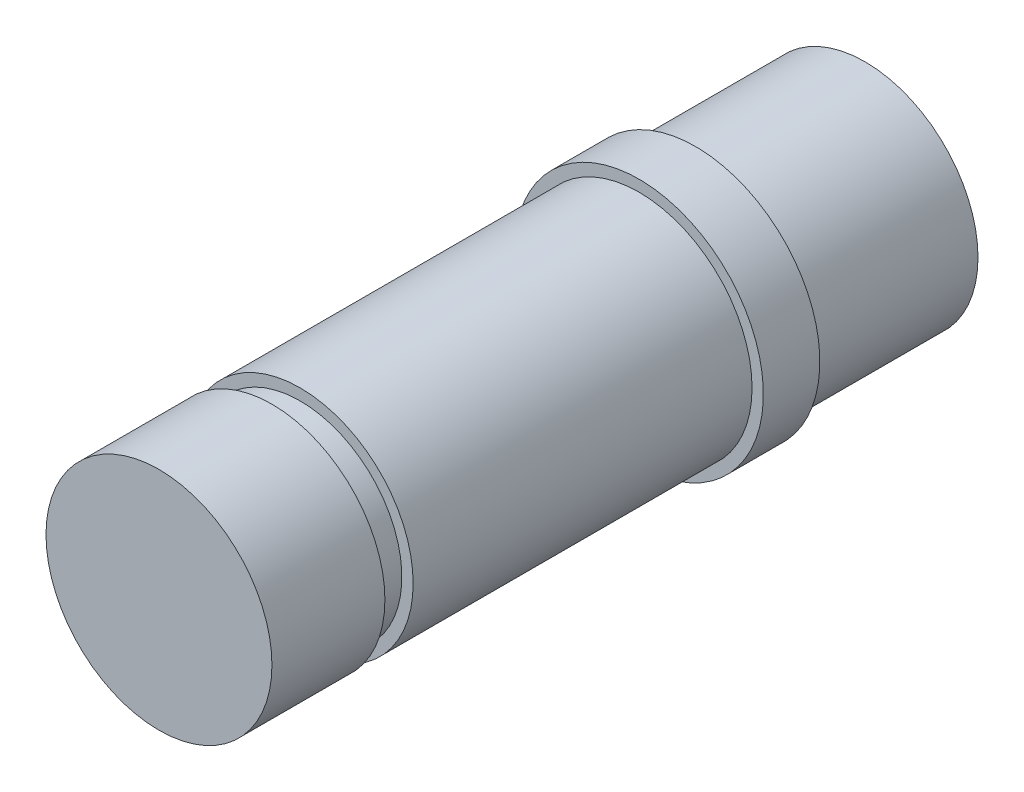
ISO-10303-21;
HEADER;
FILE_DESCRIPTION(('STEP AP214'),'2;1');
FILE_NAME('part.step','',(''),(''),'','','');
FILE_SCHEMA(('AUTOMOTIVE_DESIGN { 1 0 10303 214 1 1 1 1 }'));
ENDSEC;
DATA;
#1=APPLICATION_CONTEXT('core data for automotive mechanical design processes');
#2=APPLICATION_PROTOCOL_DEFINITION('international standard','automotive_design',2000,#1);
#3=PRODUCT_CONTEXT('',#1,'mechanical');
#4=PRODUCT('Part','Part','',(#3));
#5=PRODUCT_RELATED_PRODUCT_CATEGORY('part','',(#4));
#6=PRODUCT_DEFINITION_FORMATION('','',#4);
#7=PRODUCT_DEFINITION_CONTEXT('part definition',#1,'design');
#8=PRODUCT_DEFINITION('design','',#6,#7);
#9=PRODUCT_DEFINITION_SHAPE('','',#8);
#10=(LENGTH_UNIT() NAMED_UNIT(*) SI_UNIT(.MILLI.,.METRE.));
#11=(NAMED_UNIT(*) PLANE_ANGLE_UNIT() SI_UNIT($,.RADIAN.));
#12=(NAMED_UNIT(*) SI_UNIT($,.STERADIAN.) SOLID_ANGLE_UNIT());
#13=UNCERTAINTY_MEASURE_WITH_UNIT(LENGTH_MEASURE(1.E-05),#10,'distance_accuracy_value','');
#14=(GEOMETRIC_REPRESENTATION_CONTEXT(3) GLOBAL_UNCERTAINTY_ASSIGNED_CONTEXT((#13)) GLOBAL_UNIT_ASSIGNED_CONTEXT((#10,
#11,#12)) REPRESENTATION_CONTEXT('',''));
#15=CARTESIAN_POINT('',(0.,0.,0.));
#16=DIRECTION('',(0.,0.,1.));
#17=DIRECTION('',(1.,0.,0.));
#18=AXIS2_PLACEMENT_3D('',#15,#16,#17);
#19=CARTESIAN_POINT('',(0.,0.,20.));
#20=DIRECTION('',(0.,0.,-1.));
#21=DIRECTION('',(-1.,0.,0.));
#22=AXIS2_PLACEMENT_3D('',#19,#20,#21);
#23=CYLINDRICAL_SURFACE('',#22,20.);
#24=CARTESIAN_POINT('',(0.,0.,20.));
#25=DIRECTION('',(0.,0.,1.));
#26=DIRECTION('',(1.,0.,0.));
#27=AXIS2_PLACEMENT_3D('',#24,#25,#26);
#28=CIRCLE('',#27,20.);
#29=CARTESIAN_POINT('',(20.,0.,20.));
#30=VERTEX_POINT('',#29);
#31=EDGE_CURVE('E47',#30,#30,#28,.T.);
#32=ORIENTED_EDGE('',*,*,#31,.F.);
#33=EDGE_LOOP('',(#32));
#34=FACE_BOUND('',#33,.T.);
#35=CARTESIAN_POINT('',(0.,0.,0.));
#36=DIRECTION('',(0.,0.,1.));
#37=DIRECTION('',(1.,0.,0.));
#38=AXIS2_PLACEMENT_3D('',#35,#36,#37);
#39=CIRCLE('',#38,20.);
#40=CARTESIAN_POINT('',(20.,0.,0.));
#41=VERTEX_POINT('',#40);
#42=EDGE_CURVE('E38',#41,#41,#39,.T.);
#43=ORIENTED_EDGE('',*,*,#42,.T.);
#44=EDGE_LOOP('',(#43));
#45=FACE_BOUND('',#44,.T.);
#46=ADVANCED_FACE('F35',(#34,#45),#23,.T.);
#47=CARTESIAN_POINT('',(0.,0.,20.));
#48=DIRECTION('',(0.,0.,1.));
#49=DIRECTION('',(1.,0.,0.));
#50=AXIS2_PLACEMENT_3D('',#47,#48,#49);
#51=PLANE('',#50);
#52=ORIENTED_EDGE('',*,*,#31,.T.);
#53=EDGE_LOOP('',(#52));
#54=FACE_BOUND('',#53,.T.);
#55=ADVANCED_FACE('F76',(#54),#51,.T.);
#56=CARTESIAN_POINT('',(0.,0.,0.));
#57=DIRECTION('',(0.,0.,1.));
#58=DIRECTION('',(1.,0.,0.));
#59=AXIS2_PLACEMENT_3D('',#56,#57,#58);
#60=PLANE('',#59);
#61=CARTESIAN_POINT('',(0.,0.,0.));
#62=DIRECTION('',(0.,0.,-1.));
#63=DIRECTION('',(-1.,0.,0.));
#64=AXIS2_PLACEMENT_3D('',#61,#62,#63);
#65=CIRCLE('',#64,18.);
#66=CARTESIAN_POINT('',(-18.,0.,0.));
#67=VERTEX_POINT('',#66);
#68=EDGE_CURVE('E42',#67,#67,#65,.T.);
#69=ORIENTED_EDGE('',*,*,#68,.F.);
#70=EDGE_LOOP('',(#69));
#71=FACE_BOUND('',#70,.T.);
#72=ORIENTED_EDGE('',*,*,#42,.F.);
#73=EDGE_LOOP('',(#72));
#74=FACE_BOUND('',#73,.T.);
#75=ADVANCED_FACE('F73',(#71,#74),#60,.F.);
#76=CARTESIAN_POINT('',(0.,0.,-5.));
#77=DIRECTION('',(0.,0.,1.));
#78=DIRECTION('',(1.,0.,0.));
#79=AXIS2_PLACEMENT_3D('',#76,#77,#78);
#80=CYLINDRICAL_SURFACE('',#79,18.);
#81=CARTESIAN_POINT('',(0.,0.,-5.));
#82=DIRECTION('',(0.,0.,-1.));
#83=DIRECTION('',(-1.,0.,0.));
#84=AXIS2_PLACEMENT_3D('',#81,#82,#83);
#85=CIRCLE('',#84,18.);
#86=CARTESIAN_POINT('',(-18.,0.,-5.));
#87=VERTEX_POINT('',#86);
#88=EDGE_CURVE('E62',#87,#87,#85,.T.);
#89=ORIENTED_EDGE('',*,*,#88,.F.);
#90=EDGE_LOOP('',(#89));
#91=FACE_BOUND('',#90,.T.);
#92=ORIENTED_EDGE('',*,*,#68,.T.);
#93=EDGE_LOOP('',(#92));
#94=FACE_BOUND('',#93,.T.);
#95=ADVANCED_FACE('F75',(#91,#94),#80,.T.);
#96=CARTESIAN_POINT('',(0.,0.,-65.));
#97=DIRECTION('',(0.,0.,1.));
#98=DIRECTION('',(1.,0.,0.));
#99=AXIS2_PLACEMENT_3D('',#96,#97,#98);
#100=CYLINDRICAL_SURFACE('',#99,20.);
#101=CARTESIAN_POINT('',(0.,0.,-65.));
#102=DIRECTION('',(0.,0.,-1.));
#103=DIRECTION('',(-1.,0.,0.));
#104=AXIS2_PLACEMENT_3D('',#101,#102,#103);
#105=CIRCLE('',#104,20.);
#106=CARTESIAN_POINT('',(-20.,0.,-65.));
#107=VERTEX_POINT('',#106);
#108=EDGE_CURVE('E59',#107,#107,#105,.T.);
#109=ORIENTED_EDGE('',*,*,#108,.F.);
#110=EDGE_LOOP('',(#109));
#111=FACE_BOUND('',#110,.T.);
#112=CARTESIAN_POINT('',(0.,0.,-5.));
#113=DIRECTION('',(0.,0.,-1.));
#114=DIRECTION('',(-1.,0.,0.));
#115=AXIS2_PLACEMENT_3D('',#112,#113,#114);
#116=CIRCLE('',#115,20.);
#117=CARTESIAN_POINT('',(-20.,0.,-5.));
#118=VERTEX_POINT('',#117);
#119=EDGE_CURVE('E55',#118,#118,#116,.T.);
#120=ORIENTED_EDGE('',*,*,#119,.T.);
#121=EDGE_LOOP('',(#120));
#122=FACE_BOUND('',#121,.T.);
#123=ADVANCED_FACE('F82',(#111,#122),#100,.T.);
#124=CARTESIAN_POINT('',(0.,0.,-5.));
#125=DIRECTION('',(0.,0.,-1.));
#126=DIRECTION('',(-1.,0.,0.));
#127=AXIS2_PLACEMENT_3D('',#124,#125,#126);
#128=PLANE('',#127);
#129=ORIENTED_EDGE('',*,*,#88,.T.);
#130=EDGE_LOOP('',(#129));
#131=FACE_BOUND('',#130,.T.);
#132=ORIENTED_EDGE('',*,*,#119,.F.);
#133=EDGE_LOOP('',(#132));
#134=FACE_BOUND('',#133,.T.);
#135=ADVANCED_FACE('F117',(#131,#134),#128,.F.);
#136=CARTESIAN_POINT('',(0.,0.,-75.));
#137=DIRECTION('',(0.,0.,1.));
#138=DIRECTION('',(1.,0.,0.));
#139=AXIS2_PLACEMENT_3D('',#136,#137,#138);
#140=CYLINDRICAL_SURFACE('',#139,22.);
#141=CARTESIAN_POINT('',(0.,0.,-75.));
#142=DIRECTION('',(0.,0.,-1.));
#143=DIRECTION('',(-1.,0.,0.));
#144=AXIS2_PLACEMENT_3D('',#141,#142,#143);
#145=CIRCLE('',#144,22.);
#146=CARTESIAN_POINT('',(-22.,0.,-75.));
#147=VERTEX_POINT('',#146);
#148=EDGE_CURVE('E52',#147,#147,#145,.T.);
#149=ORIENTED_EDGE('',*,*,#148,.F.);
#150=EDGE_LOOP('',(#149));
#151=FACE_BOUND('',#150,.T.);
#152=CARTESIAN_POINT('',(0.,0.,-65.));
#153=DIRECTION('',(0.,0.,-1.));
#154=DIRECTION('',(-1.,0.,0.));
#155=AXIS2_PLACEMENT_3D('',#152,#153,#154);
#156=CIRCLE('',#155,22.);
#157=CARTESIAN_POINT('',(-22.,0.,-65.));
#158=VERTEX_POINT('',#157);
#159=EDGE_CURVE('E56',#158,#158,#156,.T.);
#160=ORIENTED_EDGE('',*,*,#159,.T.);
#161=EDGE_LOOP('',(#160));
#162=FACE_BOUND('',#161,.T.);
#163=ADVANCED_FACE('F128',(#151,#162),#140,.T.);
#164=CARTESIAN_POINT('',(0.,0.,-75.));
#165=DIRECTION('',(0.,0.,-1.));
#166=DIRECTION('',(-1.,0.,0.));
#167=AXIS2_PLACEMENT_3D('',#164,#165,#166);
#168=PLANE('',#167);
#169=CARTESIAN_POINT('',(0.,0.,-75.));
#170=DIRECTION('',(0.,0.,-1.));
#171=DIRECTION('',(-1.,0.,0.));
#172=AXIS2_PLACEMENT_3D('',#169,#170,#171);
#173=CIRCLE('',#172,20.);
#174=CARTESIAN_POINT('',(-20.,0.,-75.));
#175=VERTEX_POINT('',#174);
#176=EDGE_CURVE('E10',#175,#175,#173,.T.);
#177=ORIENTED_EDGE('',*,*,#176,.F.);
#178=EDGE_LOOP('',(#177));
#179=FACE_BOUND('',#178,.T.);
#180=ORIENTED_EDGE('',*,*,#148,.T.);
#181=EDGE_LOOP('',(#180));
#182=FACE_BOUND('',#181,.T.);
#183=ADVANCED_FACE('F139',(#179,#182),#168,.T.);
#184=CARTESIAN_POINT('',(0.,0.,-65.));
#185=DIRECTION('',(0.,0.,-1.));
#186=DIRECTION('',(-1.,0.,0.));
#187=AXIS2_PLACEMENT_3D('',#184,#185,#186);
#188=PLANE('',#187);
#189=ORIENTED_EDGE('',*,*,#108,.T.);
#190=EDGE_LOOP('',(#189));
#191=FACE_BOUND('',#190,.T.);
#192=ORIENTED_EDGE('',*,*,#159,.F.);
#193=EDGE_LOOP('',(#192));
#194=FACE_BOUND('',#193,.T.);
#195=ADVANCED_FACE('F148',(#191,#194),#188,.F.);
#196=CARTESIAN_POINT('',(0.,0.,-105.));
#197=DIRECTION('',(0.,0.,1.));
#198=DIRECTION('',(1.,0.,0.));
#199=AXIS2_PLACEMENT_3D('',#196,#197,#198);
#200=CYLINDRICAL_SURFACE('',#199,20.);
#201=CARTESIAN_POINT('',(0.,0.,-105.));
#202=DIRECTION('',(0.,0.,-1.));
#203=DIRECTION('',(-1.,0.,0.));
#204=AXIS2_PLACEMENT_3D('',#201,#202,#203);
#205=CIRCLE('',#204,20.);
#206=CARTESIAN_POINT('',(-20.,0.,-105.));
#207=VERTEX_POINT('',#206);
#208=EDGE_CURVE('E51',#207,#207,#205,.T.);
#209=ORIENTED_EDGE('',*,*,#208,.F.);
#210=EDGE_LOOP('',(#209));
#211=FACE_BOUND('',#210,.T.);
#212=ORIENTED_EDGE('',*,*,#176,.T.);
#213=EDGE_LOOP('',(#212));
#214=FACE_BOUND('',#213,.T.);
#215=ADVANCED_FACE('F153',(#211,#214),#200,.T.);
#216=CARTESIAN_POINT('',(0.,0.,-105.));
#217=DIRECTION('',(0.,0.,-1.));
#218=DIRECTION('',(-1.,0.,0.));
#219=AXIS2_PLACEMENT_3D('',#216,#217,#218);
#220=PLANE('',#219);
#221=ORIENTED_EDGE('',*,*,#208,.T.);
#222=EDGE_LOOP('',(#221));
#223=FACE_BOUND('',#222,.T.);
#224=ADVANCED_FACE('F172',(#223),#220,.T.);
#225=CLOSED_SHELL('',(#46,#55,#75,#95,#123,#135,#163,#183,#195,#215,#224));
#226=MANIFOLD_SOLID_BREP('B2',#225);
#227=ADVANCED_BREP_SHAPE_REPRESENTATION('',(#18,#226),#14);
#228=SHAPE_DEFINITION_REPRESENTATION(#9,#227);
ENDSEC;
END-ISO-10303-21;
